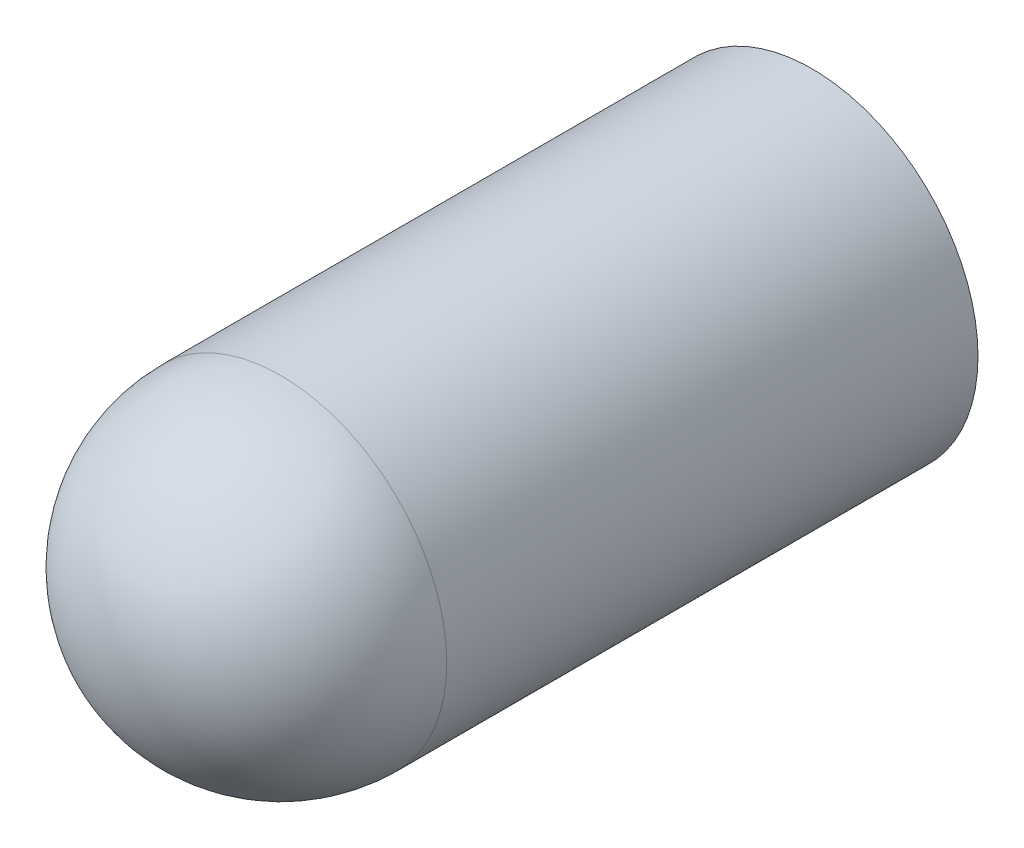
ISO-10303-21;
HEADER;
FILE_DESCRIPTION(('STEP AP214'),'2;1');
FILE_NAME('part.step','',(''),(''),'','','');
FILE_SCHEMA(('AUTOMOTIVE_DESIGN { 1 0 10303 214 1 1 1 1 }'));
ENDSEC;
DATA;
#1=APPLICATION_CONTEXT('core data for automotive mechanical design processes');
#2=APPLICATION_PROTOCOL_DEFINITION('international standard','automotive_design',2000,#1);
#3=PRODUCT_CONTEXT('',#1,'mechanical');
#4=PRODUCT('Part','Part','',(#3));
#5=PRODUCT_RELATED_PRODUCT_CATEGORY('part','',(#4));
#6=PRODUCT_DEFINITION_FORMATION('','',#4);
#7=PRODUCT_DEFINITION_CONTEXT('part definition',#1,'design');
#8=PRODUCT_DEFINITION('design','',#6,#7);
#9=PRODUCT_DEFINITION_SHAPE('','',#8);
#10=(LENGTH_UNIT() NAMED_UNIT(*) SI_UNIT(.MILLI.,.METRE.));
#11=(NAMED_UNIT(*) PLANE_ANGLE_UNIT() SI_UNIT($,.RADIAN.));
#12=(NAMED_UNIT(*) SI_UNIT($,.STERADIAN.) SOLID_ANGLE_UNIT());
#13=UNCERTAINTY_MEASURE_WITH_UNIT(LENGTH_MEASURE(1.E-05),#10,'distance_accuracy_value','');
#14=(GEOMETRIC_REPRESENTATION_CONTEXT(3) GLOBAL_UNCERTAINTY_ASSIGNED_CONTEXT((#13)) GLOBAL_UNIT_ASSIGNED_CONTEXT((#10,
#11,#12)) REPRESENTATION_CONTEXT('',''));
#15=CARTESIAN_POINT('',(0.,0.,0.));
#16=DIRECTION('',(0.,0.,1.));
#17=DIRECTION('',(1.,0.,0.));
#18=AXIS2_PLACEMENT_3D('',#15,#16,#17);
#19=CARTESIAN_POINT('',(0.,0.,-72.));
#20=DIRECTION('',(0.,0.,1.));
#21=DIRECTION('',(1.,0.,0.));
#22=AXIS2_PLACEMENT_3D('',#19,#20,#21);
#23=CYLINDRICAL_SURFACE('',#22,22.5);
#24=CARTESIAN_POINT('',(0.,0.,-72.));
#25=DIRECTION('',(0.,0.,1.));
#26=DIRECTION('',(1.,0.,0.));
#27=AXIS2_PLACEMENT_3D('',#24,#25,#26);
#28=CIRCLE('',#27,22.5);
#29=CARTESIAN_POINT('',(22.5,0.,-72.));
#30=VERTEX_POINT('',#29);
#31=EDGE_CURVE('E10',#30,#30,#28,.T.);
#32=ORIENTED_EDGE('',*,*,#31,.T.);
#33=EDGE_LOOP('',(#32));
#34=FACE_BOUND('',#33,.T.);
#35=CARTESIAN_POINT('',(0.,0.,0.));
#36=DIRECTION('',(0.,0.,1.));
#37=DIRECTION('',(1.,0.,0.));
#38=AXIS2_PLACEMENT_3D('',#35,#36,#37);
#39=CIRCLE('',#38,22.5);
#40=CARTESIAN_POINT('',(22.5,0.,0.));
#41=VERTEX_POINT('',#40);
#42=EDGE_CURVE('E35',#41,#41,#39,.T.);
#43=ORIENTED_EDGE('',*,*,#42,.F.);
#44=EDGE_LOOP('',(#43));
#45=FACE_BOUND('',#44,.T.);
#46=ADVANCED_FACE('F32',(#34,#45),#23,.T.);
#47=CARTESIAN_POINT('',(0.,0.,-72.));
#48=DIRECTION('',(0.,0.,1.));
#49=DIRECTION('',(1.,0.,0.));
#50=AXIS2_PLACEMENT_3D('',#47,#48,#49);
#51=PLANE('',#50);
#52=CARTESIAN_POINT('',(0.,0.,-72.));
#53=DIRECTION('',(0.,0.,-1.));
#54=DIRECTION('',(-1.,0.,0.));
#55=AXIS2_PLACEMENT_3D('',#52,#53,#54);
#56=CIRCLE('',#55,15.);
#57=CARTESIAN_POINT('',(-15.,0.,-72.));
#58=VERTEX_POINT('',#57);
#59=EDGE_CURVE('E44',#58,#58,#56,.T.);
#60=ORIENTED_EDGE('',*,*,#59,.F.);
#61=EDGE_LOOP('',(#60));
#62=FACE_BOUND('',#61,.T.);
#63=ORIENTED_EDGE('',*,*,#31,.F.);
#64=EDGE_LOOP('',(#63));
#65=FACE_BOUND('',#64,.T.);
#66=ADVANCED_FACE('F55',(#62,#65),#51,.F.);
#67=CARTESIAN_POINT('',(0.,0.,-42.));
#68=DIRECTION('',(0.,0.,-1.));
#69=DIRECTION('',(-1.,0.,0.));
#70=AXIS2_PLACEMENT_3D('',#67,#68,#69);
#71=CYLINDRICAL_SURFACE('',#70,15.);
#72=CARTESIAN_POINT('',(0.,0.,-42.));
#73=DIRECTION('',(0.,0.,-1.));
#74=DIRECTION('',(-1.,0.,0.));
#75=AXIS2_PLACEMENT_3D('',#72,#73,#74);
#76=CIRCLE('',#75,15.);
#77=CARTESIAN_POINT('',(-15.,0.,-42.));
#78=VERTEX_POINT('',#77);
#79=EDGE_CURVE('E42',#78,#78,#76,.T.);
#80=ORIENTED_EDGE('',*,*,#79,.F.);
#81=EDGE_LOOP('',(#80));
#82=FACE_BOUND('',#81,.T.);
#83=ORIENTED_EDGE('',*,*,#59,.T.);
#84=EDGE_LOOP('',(#83));
#85=FACE_BOUND('',#84,.T.);
#86=ADVANCED_FACE('F52',(#82,#85),#71,.F.);
#87=CARTESIAN_POINT('',(0.,0.,-42.));
#88=DIRECTION('',(0.,0.,-1.));
#89=DIRECTION('',(-1.,0.,0.));
#90=AXIS2_PLACEMENT_3D('',#87,#88,#89);
#91=PLANE('',#90);
#92=ORIENTED_EDGE('',*,*,#79,.T.);
#93=EDGE_LOOP('',(#92));
#94=FACE_BOUND('',#93,.T.);
#95=ADVANCED_FACE('F50',(#94),#91,.T.);
#96=CARTESIAN_POINT('',(0.,0.,0.));
#97=DIRECTION('',(0.,1.,0.));
#98=DIRECTION('',(1.,0.,0.));
#99=AXIS2_PLACEMENT_3D('',#96,#97,#98);
#100=SPHERICAL_SURFACE('',#99,22.5);
#101=CARTESIAN_POINT('',(0.,0.,0.));
#102=DIRECTION('',(0.,0.,1.));
#103=DIRECTION('',(1.,0.,0.));
#104=AXIS2_PLACEMENT_3D('',#101,#102,#103);
#105=SPHERICAL_SURFACE('',#104,22.5);
#106=ORIENTED_EDGE('',*,*,#42,.T.);
#107=EDGE_LOOP('',(#106));
#108=FACE_BOUND('',#107,.T.);
#109=ADVANCED_FACE('F67',(#108),#105,.T.);
#110=CLOSED_SHELL('',(#46,#66,#86,#95,#109));
#111=MANIFOLD_SOLID_BREP('B2',#110);
#112=ADVANCED_BREP_SHAPE_REPRESENTATION('',(#18,#111),#14);
#113=SHAPE_DEFINITION_REPRESENTATION(#9,#112);
ENDSEC;
END-ISO-10303-21;
